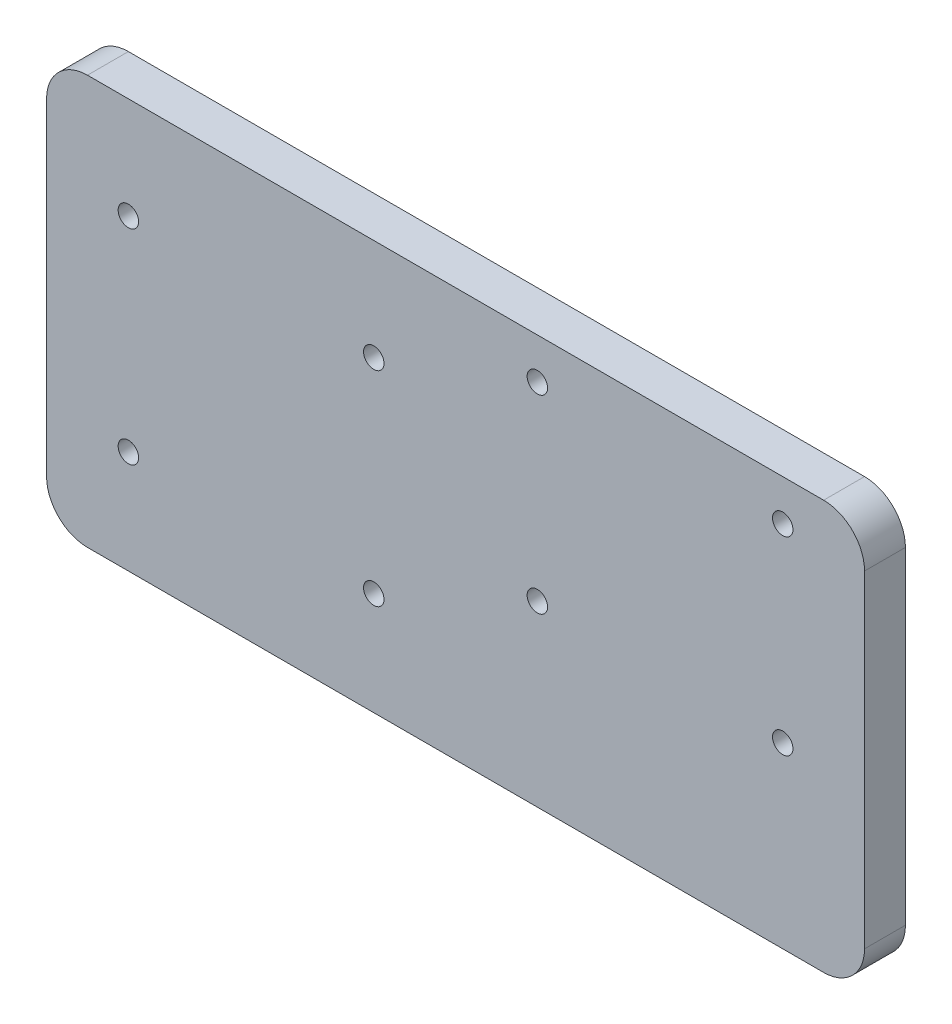
ISO-10303-21;
HEADER;
FILE_DESCRIPTION(('STEP AP214'),'2;1');
FILE_NAME('part.step','',(''),(''),'','','');
FILE_SCHEMA(('AUTOMOTIVE_DESIGN { 1 0 10303 214 1 1 1 1 }'));
ENDSEC;
DATA;
#1=APPLICATION_CONTEXT('core data for automotive mechanical design processes');
#2=APPLICATION_PROTOCOL_DEFINITION('international standard','automotive_design',2000,#1);
#3=PRODUCT_CONTEXT('',#1,'mechanical');
#4=PRODUCT('Part','Part','',(#3));
#5=PRODUCT_RELATED_PRODUCT_CATEGORY('part','',(#4));
#6=PRODUCT_DEFINITION_FORMATION('','',#4);
#7=PRODUCT_DEFINITION_CONTEXT('part definition',#1,'design');
#8=PRODUCT_DEFINITION('design','',#6,#7);
#9=PRODUCT_DEFINITION_SHAPE('','',#8);
#10=(LENGTH_UNIT() NAMED_UNIT(*) SI_UNIT(.MILLI.,.METRE.));
#11=(NAMED_UNIT(*) PLANE_ANGLE_UNIT() SI_UNIT($,.RADIAN.));
#12=(NAMED_UNIT(*) SI_UNIT($,.STERADIAN.) SOLID_ANGLE_UNIT());
#13=UNCERTAINTY_MEASURE_WITH_UNIT(LENGTH_MEASURE(1.E-05),#10,'distance_accuracy_value','');
#14=(GEOMETRIC_REPRESENTATION_CONTEXT(3) GLOBAL_UNCERTAINTY_ASSIGNED_CONTEXT((#13)) GLOBAL_UNIT_ASSIGNED_CONTEXT((#10,
#11,#12)) REPRESENTATION_CONTEXT('',''));
#15=CARTESIAN_POINT('',(0.,0.,0.));
#16=DIRECTION('',(0.,0.,1.));
#17=DIRECTION('',(1.,0.,0.));
#18=AXIS2_PLACEMENT_3D('',#15,#16,#17);
#19=CARTESIAN_POINT('',(-26.3015892013934,-13.0971314207675,11.3107394403225));
#20=DIRECTION('',(1.,0.,0.));
#21=DIRECTION('',(0.,0.,-1.));
#22=AXIS2_PLACEMENT_3D('',#19,#20,#21);
#23=PLANE('',#22);
#24=DIRECTION('',(0.,-1.,0.));
#25=VECTOR('',#24,1.);
#26=CARTESIAN_POINT('',(-26.3015892013934,-13.0971314207675,-1.31176055967752));
#27=LINE('',#26,#25);
#28=CARTESIAN_POINT('',(-26.3015892013934,100.505368579232,-1.31176055967752));
#29=VERTEX_POINT('',#28);
#30=CARTESIAN_POINT('',(-26.3015892013934,-0.474631420767529,-1.31176055967752));
#31=VERTEX_POINT('',#30);
#32=EDGE_CURVE('E241',#29,#31,#27,.T.);
#33=ORIENTED_EDGE('',*,*,#32,.T.);
#34=DIRECTION('',(0.,0.,-1.));
#35=VECTOR('',#34,1.);
#36=CARTESIAN_POINT('',(-26.3015892013934,-0.474631420767529,11.3107394403225));
#37=LINE('',#36,#35);
#38=CARTESIAN_POINT('',(-26.3015892013934,-0.474631420767529,11.3107394403225));
#39=VERTEX_POINT('',#38);
#40=EDGE_CURVE('E277',#31,#39,#37,.F.);
#41=ORIENTED_EDGE('',*,*,#40,.T.);
#42=DIRECTION('',(0.,-1.,0.));
#43=VECTOR('',#42,1.);
#44=CARTESIAN_POINT('',(-26.3015892013934,-13.0971314207675,11.3107394403225));
#45=LINE('',#44,#43);
#46=CARTESIAN_POINT('',(-26.3015892013934,100.505368579232,11.3107394403225));
#47=VERTEX_POINT('',#46);
#48=EDGE_CURVE('E242',#47,#39,#45,.T.);
#49=ORIENTED_EDGE('',*,*,#48,.F.);
#50=DIRECTION('',(0.,0.,-1.));
#51=VECTOR('',#50,1.);
#52=CARTESIAN_POINT('',(-26.3015892013934,100.505368579232,11.3107394403225));
#53=LINE('',#52,#51);
#54=EDGE_CURVE('E253',#47,#29,#53,.T.);
#55=ORIENTED_EDGE('',*,*,#54,.T.);
#56=EDGE_LOOP('',(#33,#41,#49,#55));
#57=FACE_BOUND('',#56,.T.);
#58=ADVANCED_FACE('F37',(#57),#23,.F.);
#59=CARTESIAN_POINT('',(-26.3015892013934,-13.0971314207675,11.3107394403225));
#60=DIRECTION('',(0.,1.,0.));
#61=DIRECTION('',(0.,0.,1.));
#62=AXIS2_PLACEMENT_3D('',#59,#60,#61);
#63=PLANE('',#62);
#64=DIRECTION('',(1.,0.,0.));
#65=VECTOR('',#64,1.);
#66=CARTESIAN_POINT('',(-26.3015892013934,-13.0971314207675,-1.31176055967752));
#67=LINE('',#66,#65);
#68=CARTESIAN_POINT('',(-13.6790892013933,-13.0971314207675,-1.31176055967752));
#69=VERTEX_POINT('',#68);
#70=CARTESIAN_POINT('',(213.525910798607,-13.0971314207675,-1.31176055967752));
#71=VERTEX_POINT('',#70);
#72=EDGE_CURVE('E256',#69,#71,#67,.T.);
#73=ORIENTED_EDGE('',*,*,#72,.T.);
#74=DIRECTION('',(0.,0.,-1.));
#75=VECTOR('',#74,1.);
#76=CARTESIAN_POINT('',(213.525910798607,-13.0971314207675,11.3107394403225));
#77=LINE('',#76,#75);
#78=CARTESIAN_POINT('',(213.525910798607,-13.0971314207675,11.3107394403225));
#79=VERTEX_POINT('',#78);
#80=EDGE_CURVE('E286',#71,#79,#77,.F.);
#81=ORIENTED_EDGE('',*,*,#80,.T.);
#82=DIRECTION('',(1.,0.,0.));
#83=VECTOR('',#82,1.);
#84=CARTESIAN_POINT('',(-26.3015892013934,-13.0971314207675,11.3107394403225));
#85=LINE('',#84,#83);
#86=CARTESIAN_POINT('',(-13.6790892013933,-13.0971314207675,11.3107394403225));
#87=VERTEX_POINT('',#86);
#88=EDGE_CURVE('E245',#87,#79,#85,.T.);
#89=ORIENTED_EDGE('',*,*,#88,.F.);
#90=DIRECTION('',(0.,0.,-1.));
#91=VECTOR('',#90,1.);
#92=CARTESIAN_POINT('',(-13.6790892013933,-13.0971314207675,11.3107394403225));
#93=LINE('',#92,#91);
#94=EDGE_CURVE('E272',#87,#69,#93,.T.);
#95=ORIENTED_EDGE('',*,*,#94,.T.);
#96=EDGE_LOOP('',(#73,#81,#89,#95));
#97=FACE_BOUND('',#96,.T.);
#98=ADVANCED_FACE('F318',(#97),#63,.F.);
#99=CARTESIAN_POINT('',(226.148410798607,-13.0971314207675,11.3107394403225));
#100=DIRECTION('',(-1.,0.,0.));
#101=DIRECTION('',(0.,0.,1.));
#102=AXIS2_PLACEMENT_3D('',#99,#100,#101);
#103=PLANE('',#102);
#104=DIRECTION('',(0.,1.,0.));
#105=VECTOR('',#104,1.);
#106=CARTESIAN_POINT('',(226.148410798607,-13.0971314207675,-1.31176055967752));
#107=LINE('',#106,#105);
#108=CARTESIAN_POINT('',(226.148410798607,-0.474631420767529,-1.31176055967752));
#109=VERTEX_POINT('',#108);
#110=CARTESIAN_POINT('',(226.148410798607,100.505368579232,-1.31176055967752));
#111=VERTEX_POINT('',#110);
#112=EDGE_CURVE('E259',#109,#111,#107,.T.);
#113=ORIENTED_EDGE('',*,*,#112,.T.);
#114=DIRECTION('',(0.,0.,-1.));
#115=VECTOR('',#114,1.);
#116=CARTESIAN_POINT('',(226.148410798607,100.505368579232,11.3107394403225));
#117=LINE('',#116,#115);
#118=CARTESIAN_POINT('',(226.148410798607,100.505368579232,11.3107394403225));
#119=VERTEX_POINT('',#118);
#120=EDGE_CURVE('E45',#111,#119,#117,.F.);
#121=ORIENTED_EDGE('',*,*,#120,.T.);
#122=DIRECTION('',(0.,1.,0.));
#123=VECTOR('',#122,1.);
#124=CARTESIAN_POINT('',(226.148410798607,-13.0971314207675,11.3107394403225));
#125=LINE('',#124,#123);
#126=CARTESIAN_POINT('',(226.148410798607,-0.474631420767529,11.3107394403225));
#127=VERTEX_POINT('',#126);
#128=EDGE_CURVE('E249',#127,#119,#125,.T.);
#129=ORIENTED_EDGE('',*,*,#128,.F.);
#130=DIRECTION('',(0.,0.,-1.));
#131=VECTOR('',#130,1.);
#132=CARTESIAN_POINT('',(226.148410798607,-0.474631420767529,11.3107394403225));
#133=LINE('',#132,#131);
#134=EDGE_CURVE('E281',#127,#109,#133,.T.);
#135=ORIENTED_EDGE('',*,*,#134,.T.);
#136=EDGE_LOOP('',(#113,#121,#129,#135));
#137=FACE_BOUND('',#136,.T.);
#138=ADVANCED_FACE('F324',(#137),#103,.F.);
#139=CARTESIAN_POINT('',(-26.3015892013934,113.127868579232,11.3107394403225));
#140=DIRECTION('',(0.,-1.,0.));
#141=DIRECTION('',(0.,0.,-1.));
#142=AXIS2_PLACEMENT_3D('',#139,#140,#141);
#143=PLANE('',#142);
#144=DIRECTION('',(-1.,0.,0.));
#145=VECTOR('',#144,1.);
#146=CARTESIAN_POINT('',(-26.3015892013934,113.127868579232,11.3107394403225));
#147=LINE('',#146,#145);
#148=CARTESIAN_POINT('',(213.525910798607,113.127868579232,11.3107394403225));
#149=VERTEX_POINT('',#148);
#150=CARTESIAN_POINT('',(-13.6790892013933,113.127868579232,11.3107394403225));
#151=VERTEX_POINT('',#150);
#152=EDGE_CURVE('E251',#149,#151,#147,.T.);
#153=ORIENTED_EDGE('',*,*,#152,.F.);
#154=DIRECTION('',(0.,0.,-1.));
#155=VECTOR('',#154,1.);
#156=CARTESIAN_POINT('',(213.525910798607,113.127868579232,11.3107394403225));
#157=LINE('',#156,#155);
#158=CARTESIAN_POINT('',(213.525910798607,113.127868579232,-1.31176055967752));
#159=VERTEX_POINT('',#158);
#160=EDGE_CURVE('E290',#149,#159,#157,.T.);
#161=ORIENTED_EDGE('',*,*,#160,.T.);
#162=DIRECTION('',(-1.,0.,0.));
#163=VECTOR('',#162,1.);
#164=CARTESIAN_POINT('',(-26.3015892013934,113.127868579232,-1.31176055967752));
#165=LINE('',#164,#163);
#166=CARTESIAN_POINT('',(-13.6790892013933,113.127868579232,-1.31176055967752));
#167=VERTEX_POINT('',#166);
#168=EDGE_CURVE('E246',#159,#167,#165,.T.);
#169=ORIENTED_EDGE('',*,*,#168,.T.);
#170=DIRECTION('',(0.,0.,-1.));
#171=VECTOR('',#170,1.);
#172=CARTESIAN_POINT('',(-13.6790892013933,113.127868579232,11.3107394403225));
#173=LINE('',#172,#171);
#174=EDGE_CURVE('E267',#167,#151,#173,.F.);
#175=ORIENTED_EDGE('',*,*,#174,.T.);
#176=EDGE_LOOP('',(#153,#161,#169,#175));
#177=FACE_BOUND('',#176,.T.);
#178=ADVANCED_FACE('F296',(#177),#143,.F.);
#179=CARTESIAN_POINT('',(-26.3015892013934,-13.0971314207675,11.3107394403225));
#180=DIRECTION('',(0.,0.,-1.));
#181=DIRECTION('',(-1.,0.,0.));
#182=AXIS2_PLACEMENT_3D('',#179,#180,#181);
#183=PLANE('',#182);
#184=CARTESIAN_POINT('',(200.903410798607,41.9723449445708,11.3107394403225));
#185=DIRECTION('',(0.,0.,1.));
#186=DIRECTION('',(1.,0.,0.));
#187=AXIS2_PLACEMENT_3D('',#184,#185,#186);
#188=CIRCLE('',#187,3.155625);
#189=CARTESIAN_POINT('',(204.059035798607,41.9723449445708,11.3107394403225));
#190=VERTEX_POINT('',#189);
#191=EDGE_CURVE('E147',#190,#190,#188,.T.);
#192=ORIENTED_EDGE('',*,*,#191,.F.);
#193=EDGE_LOOP('',(#192));
#194=FACE_BOUND('',#193,.T.);
#195=CARTESIAN_POINT('',(125.168410798607,41.9723449445708,11.3107394403225));
#196=DIRECTION('',(0.,0.,1.));
#197=DIRECTION('',(1.,0.,0.));
#198=AXIS2_PLACEMENT_3D('',#195,#196,#197);
#199=CIRCLE('',#198,3.15562499999999);
#200=CARTESIAN_POINT('',(128.324035798607,41.9723449445708,11.3107394403225));
#201=VERTEX_POINT('',#200);
#202=EDGE_CURVE('E146',#201,#201,#199,.T.);
#203=ORIENTED_EDGE('',*,*,#202,.F.);
#204=EDGE_LOOP('',(#203));
#205=FACE_BOUND('',#204,.T.);
#206=CARTESIAN_POINT('',(200.903410798607,100.505368579233,11.3107394403225));
#207=DIRECTION('',(0.,0.,1.));
#208=DIRECTION('',(1.,0.,0.));
#209=AXIS2_PLACEMENT_3D('',#206,#207,#208);
#210=CIRCLE('',#209,3.155625);
#211=CARTESIAN_POINT('',(204.059035798607,100.505368579233,11.3107394403225));
#212=VERTEX_POINT('',#211);
#213=EDGE_CURVE('E157',#212,#212,#210,.T.);
#214=ORIENTED_EDGE('',*,*,#213,.F.);
#215=EDGE_LOOP('',(#214));
#216=FACE_BOUND('',#215,.T.);
#217=CARTESIAN_POINT('',(125.168410798607,100.505368579233,11.3107394403225));
#218=DIRECTION('',(0.,0.,1.));
#219=DIRECTION('',(1.,0.,0.));
#220=AXIS2_PLACEMENT_3D('',#217,#218,#219);
#221=CIRCLE('',#220,3.155625);
#222=CARTESIAN_POINT('',(128.324035798607,100.505368579233,11.3107394403225));
#223=VERTEX_POINT('',#222);
#224=EDGE_CURVE('E163',#223,#223,#221,.T.);
#225=ORIENTED_EDGE('',*,*,#224,.F.);
#226=EDGE_LOOP('',(#225));
#227=FACE_BOUND('',#226,.T.);
#228=CARTESIAN_POINT('',(74.6784107986066,18.7381008532362,11.3107394403225));
#229=DIRECTION('',(0.,0.,1.));
#230=DIRECTION('',(1.,0.,0.));
#231=AXIS2_PLACEMENT_3D('',#228,#229,#230);
#232=CIRCLE('',#231,3.15562499999999);
#233=CARTESIAN_POINT('',(77.8340357986066,18.7381008532362,11.3107394403225));
#234=VERTEX_POINT('',#233);
#235=EDGE_CURVE('E169',#234,#234,#232,.T.);
#236=ORIENTED_EDGE('',*,*,#235,.F.);
#237=EDGE_LOOP('',(#236));
#238=FACE_BOUND('',#237,.T.);
#239=CARTESIAN_POINT('',(-1.05658920139335,18.7381008532362,11.3107394403225));
#240=DIRECTION('',(0.,0.,1.));
#241=DIRECTION('',(1.,0.,0.));
#242=AXIS2_PLACEMENT_3D('',#239,#240,#241);
#243=CIRCLE('',#242,3.15562499999999);
#244=CARTESIAN_POINT('',(2.09903579860664,18.7381008532362,11.3107394403225));
#245=VERTEX_POINT('',#244);
#246=EDGE_CURVE('E175',#245,#245,#243,.T.);
#247=ORIENTED_EDGE('',*,*,#246,.F.);
#248=EDGE_LOOP('',(#247));
#249=FACE_BOUND('',#248,.T.);
#250=CARTESIAN_POINT('',(74.6784107986066,81.8190446032362,11.3107394403225));
#251=DIRECTION('',(0.,0.,1.));
#252=DIRECTION('',(1.,0.,0.));
#253=AXIS2_PLACEMENT_3D('',#250,#251,#252);
#254=CIRCLE('',#253,3.15562499999999);
#255=CARTESIAN_POINT('',(77.8340357986066,81.8190446032362,11.3107394403225));
#256=VERTEX_POINT('',#255);
#257=EDGE_CURVE('E181',#256,#256,#254,.T.);
#258=ORIENTED_EDGE('',*,*,#257,.F.);
#259=EDGE_LOOP('',(#258));
#260=FACE_BOUND('',#259,.T.);
#261=CARTESIAN_POINT('',(-1.05658920139335,81.8190446032362,11.3107394403225));
#262=DIRECTION('',(0.,0.,1.));
#263=DIRECTION('',(1.,0.,0.));
#264=AXIS2_PLACEMENT_3D('',#261,#262,#263);
#265=CIRCLE('',#264,3.15562499999999);
#266=CARTESIAN_POINT('',(2.09903579860664,81.8190446032362,11.3107394403225));
#267=VERTEX_POINT('',#266);
#268=EDGE_CURVE('E187',#267,#267,#265,.T.);
#269=ORIENTED_EDGE('',*,*,#268,.F.);
#270=EDGE_LOOP('',(#269));
#271=FACE_BOUND('',#270,.T.);
#272=ORIENTED_EDGE('',*,*,#128,.T.);
#273=CARTESIAN_POINT('',(213.525910798607,100.505368579232,11.3107394403225));
#274=DIRECTION('',(0.,0.,-1.));
#275=DIRECTION('',(-1.,0.,0.));
#276=AXIS2_PLACEMENT_3D('',#273,#274,#275);
#277=CIRCLE('',#276,12.6225);
#278=EDGE_CURVE('E11',#119,#149,#277,.F.);
#279=ORIENTED_EDGE('',*,*,#278,.T.);
#280=ORIENTED_EDGE('',*,*,#152,.T.);
#281=CARTESIAN_POINT('',(-13.6790892013933,100.505368579232,11.3107394403225));
#282=DIRECTION('',(0.,0.,-1.));
#283=DIRECTION('',(-1.,0.,0.));
#284=AXIS2_PLACEMENT_3D('',#281,#282,#283);
#285=CIRCLE('',#284,12.6225);
#286=EDGE_CURVE('E270',#151,#47,#285,.F.);
#287=ORIENTED_EDGE('',*,*,#286,.T.);
#288=ORIENTED_EDGE('',*,*,#48,.T.);
#289=CARTESIAN_POINT('',(-13.6790892013933,-0.474631420767529,11.3107394403225));
#290=DIRECTION('',(0.,0.,-1.));
#291=DIRECTION('',(-1.,0.,0.));
#292=AXIS2_PLACEMENT_3D('',#289,#290,#291);
#293=CIRCLE('',#292,12.6225);
#294=EDGE_CURVE('E279',#39,#87,#293,.F.);
#295=ORIENTED_EDGE('',*,*,#294,.T.);
#296=ORIENTED_EDGE('',*,*,#88,.T.);
#297=CARTESIAN_POINT('',(213.525910798607,-0.474631420767529,11.3107394403225));
#298=DIRECTION('',(0.,0.,-1.));
#299=DIRECTION('',(-1.,0.,0.));
#300=AXIS2_PLACEMENT_3D('',#297,#298,#299);
#301=CIRCLE('',#300,12.6225);
#302=EDGE_CURVE('E288',#79,#127,#301,.F.);
#303=ORIENTED_EDGE('',*,*,#302,.T.);
#304=EDGE_LOOP('',(#272,#279,#280,#287,#288,#295,#296,#303));
#305=FACE_BOUND('',#304,.T.);
#306=ADVANCED_FACE('F308',(#194,#205,#216,#227,#238,#249,#260,#271,#305),#183,.F.);
#307=CARTESIAN_POINT('',(-26.3015892013934,-13.0971314207675,-1.31176055967752));
#308=DIRECTION('',(0.,0.,-1.));
#309=DIRECTION('',(-1.,0.,0.));
#310=AXIS2_PLACEMENT_3D('',#307,#308,#309);
#311=PLANE('',#310);
#312=CARTESIAN_POINT('',(74.6784107986066,8.12635676190163,-1.31176055967752));
#313=DIRECTION('',(0.,0.,-1.));
#314=DIRECTION('',(-1.,0.,0.));
#315=AXIS2_PLACEMENT_3D('',#312,#313,#314);
#316=CIRCLE('',#315,5.04899999999999);
#317=CARTESIAN_POINT('',(69.6294107986067,8.12635676190163,-1.31176055967752));
#318=VERTEX_POINT('',#317);
#319=EDGE_CURVE('E193',#318,#318,#316,.T.);
#320=ORIENTED_EDGE('',*,*,#319,.F.);
#321=EDGE_LOOP('',(#320));
#322=FACE_BOUND('',#321,.T.);
#323=CARTESIAN_POINT('',(-1.05658920139335,8.12635676190163,-1.31176055967752));
#324=DIRECTION('',(0.,0.,-1.));
#325=DIRECTION('',(-1.,0.,0.));
#326=AXIS2_PLACEMENT_3D('',#323,#324,#325);
#327=CIRCLE('',#326,5.04899999999999);
#328=CARTESIAN_POINT('',(-6.10558920139334,8.12635676190163,-1.31176055967752));
#329=VERTEX_POINT('',#328);
#330=EDGE_CURVE('E205',#329,#329,#327,.T.);
#331=ORIENTED_EDGE('',*,*,#330,.F.);
#332=EDGE_LOOP('',(#331));
#333=FACE_BOUND('',#332,.T.);
#334=CARTESIAN_POINT('',(-1.05658920139335,92.2553192619017,-1.31176055967752));
#335=DIRECTION('',(0.,0.,-1.));
#336=DIRECTION('',(-1.,0.,0.));
#337=AXIS2_PLACEMENT_3D('',#334,#335,#336);
#338=CIRCLE('',#337,5.04899999999999);
#339=CARTESIAN_POINT('',(-6.10558920139334,92.2553192619017,-1.31176055967752));
#340=VERTEX_POINT('',#339);
#341=EDGE_CURVE('E217',#340,#340,#338,.T.);
#342=ORIENTED_EDGE('',*,*,#341,.F.);
#343=EDGE_LOOP('',(#342));
#344=FACE_BOUND('',#343,.T.);
#345=CARTESIAN_POINT('',(74.6784107986066,92.2553192619017,-1.31176055967752));
#346=DIRECTION('',(0.,0.,-1.));
#347=DIRECTION('',(-1.,0.,0.));
#348=AXIS2_PLACEMENT_3D('',#345,#346,#347);
#349=CIRCLE('',#348,5.04899999999999);
#350=CARTESIAN_POINT('',(69.6294107986067,92.2553192619017,-1.31176055967752));
#351=VERTEX_POINT('',#350);
#352=EDGE_CURVE('E229',#351,#351,#349,.T.);
#353=ORIENTED_EDGE('',*,*,#352,.F.);
#354=EDGE_LOOP('',(#353));
#355=FACE_BOUND('',#354,.T.);
#356=ORIENTED_EDGE('',*,*,#168,.F.);
#357=CARTESIAN_POINT('',(213.525910798607,100.505368579232,-1.31176055967752));
#358=DIRECTION('',(0.,0.,-1.));
#359=DIRECTION('',(-1.,0.,0.));
#360=AXIS2_PLACEMENT_3D('',#357,#358,#359);
#361=CIRCLE('',#360,12.6225);
#362=EDGE_CURVE('E59',#159,#111,#361,.T.);
#363=ORIENTED_EDGE('',*,*,#362,.T.);
#364=ORIENTED_EDGE('',*,*,#112,.F.);
#365=CARTESIAN_POINT('',(213.525910798607,-0.474631420767529,-1.31176055967752));
#366=DIRECTION('',(0.,0.,-1.));
#367=DIRECTION('',(-1.,0.,0.));
#368=AXIS2_PLACEMENT_3D('',#365,#366,#367);
#369=CIRCLE('',#368,12.6225);
#370=EDGE_CURVE('E284',#109,#71,#369,.T.);
#371=ORIENTED_EDGE('',*,*,#370,.T.);
#372=ORIENTED_EDGE('',*,*,#72,.F.);
#373=CARTESIAN_POINT('',(-13.6790892013933,-0.474631420767529,-1.31176055967752));
#374=DIRECTION('',(0.,0.,-1.));
#375=DIRECTION('',(-1.,0.,0.));
#376=AXIS2_PLACEMENT_3D('',#373,#374,#375);
#377=CIRCLE('',#376,12.6225);
#378=EDGE_CURVE('E275',#69,#31,#377,.T.);
#379=ORIENTED_EDGE('',*,*,#378,.T.);
#380=ORIENTED_EDGE('',*,*,#32,.F.);
#381=CARTESIAN_POINT('',(-13.6790892013933,100.505368579232,-1.31176055967752));
#382=DIRECTION('',(0.,0.,-1.));
#383=DIRECTION('',(-1.,0.,0.));
#384=AXIS2_PLACEMENT_3D('',#381,#382,#383);
#385=CIRCLE('',#384,12.6225);
#386=EDGE_CURVE('E264',#29,#167,#385,.T.);
#387=ORIENTED_EDGE('',*,*,#386,.T.);
#388=EDGE_LOOP('',(#356,#363,#364,#371,#372,#379,#380,#387));
#389=FACE_BOUND('',#388,.T.);
#390=ADVANCED_FACE('F299',(#322,#333,#344,#355,#389),#311,.T.);
#391=CARTESIAN_POINT('',(74.6784107986066,92.2553192619017,8.78623944032248));
#392=DIRECTION('',(0.,0.,-1.));
#393=DIRECTION('',(-1.,0.,0.));
#394=AXIS2_PLACEMENT_3D('',#391,#392,#393);
#395=CONICAL_SURFACE('',#394,3.78675,1.02974425867665);
#396=CARTESIAN_POINT('',(74.6784107986066,92.2553192619017,11.0615483894251));
#397=VERTEX_POINT('',#396);
#398=VERTEX_LOOP('',#397);
#399=FACE_BOUND('',#398,.T.);
#400=CARTESIAN_POINT('',(74.6784107986066,92.2553192619017,8.78623944032248));
#401=DIRECTION('',(0.,0.,-1.));
#402=DIRECTION('',(-1.,0.,0.));
#403=AXIS2_PLACEMENT_3D('',#400,#401,#402);
#404=CIRCLE('',#403,3.78675);
#405=CARTESIAN_POINT('',(70.8916607986066,92.2553192619017,8.78623944032248));
#406=VERTEX_POINT('',#405);
#407=EDGE_CURVE('E238',#406,#406,#404,.T.);
#408=ORIENTED_EDGE('',*,*,#407,.T.);
#409=EDGE_LOOP('',(#408));
#410=FACE_BOUND('',#409,.T.);
#411=ADVANCED_FACE('F633',(#399,#410),#395,.F.);
#412=CARTESIAN_POINT('',(74.6784107986066,92.2553192619017,-1.31176055967752));
#413=DIRECTION('',(0.,0.,-1.));
#414=DIRECTION('',(-1.,0.,0.));
#415=AXIS2_PLACEMENT_3D('',#412,#413,#414);
#416=CYLINDRICAL_SURFACE('',#415,3.78675);
#417=ORIENTED_EDGE('',*,*,#407,.F.);
#418=EDGE_LOOP('',(#417));
#419=FACE_BOUND('',#418,.T.);
#420=CARTESIAN_POINT('',(74.6784107986066,92.2553192619017,1.21273944032249));
#421=DIRECTION('',(0.,0.,-1.));
#422=DIRECTION('',(-1.,0.,0.));
#423=AXIS2_PLACEMENT_3D('',#420,#421,#422);
#424=CIRCLE('',#423,3.78675);
#425=CARTESIAN_POINT('',(70.8916607986066,92.2553192619017,1.21273944032249));
#426=VERTEX_POINT('',#425);
#427=EDGE_CURVE('E235',#426,#426,#424,.T.);
#428=ORIENTED_EDGE('',*,*,#427,.T.);
#429=EDGE_LOOP('',(#428));
#430=FACE_BOUND('',#429,.T.);
#431=ADVANCED_FACE('F624',(#419,#430),#416,.F.);
#432=CARTESIAN_POINT('',(78.4651607986066,92.2553192619017,1.21273944032249));
#433=DIRECTION('',(0.,0.,1.));
#434=DIRECTION('',(1.,0.,0.));
#435=AXIS2_PLACEMENT_3D('',#432,#433,#434);
#436=PLANE('',#435);
#437=ORIENTED_EDGE('',*,*,#427,.F.);
#438=EDGE_LOOP('',(#437));
#439=FACE_BOUND('',#438,.T.);
#440=CARTESIAN_POINT('',(74.6784107986066,92.2553192619017,1.21273944032249));
#441=DIRECTION('',(0.,0.,-1.));
#442=DIRECTION('',(-1.,0.,0.));
#443=AXIS2_PLACEMENT_3D('',#440,#441,#442);
#444=CIRCLE('',#443,5.04899999999999);
#445=CARTESIAN_POINT('',(69.6294107986067,92.2553192619017,1.21273944032249));
#446=VERTEX_POINT('',#445);
#447=EDGE_CURVE('E232',#446,#446,#444,.T.);
#448=ORIENTED_EDGE('',*,*,#447,.T.);
#449=EDGE_LOOP('',(#448));
#450=FACE_BOUND('',#449,.T.);
#451=ADVANCED_FACE('F615',(#439,#450),#436,.F.);
#452=CARTESIAN_POINT('',(74.6784107986066,92.2553192619017,-1.31176055967752));
#453=DIRECTION('',(0.,0.,-1.));
#454=DIRECTION('',(-1.,0.,0.));
#455=AXIS2_PLACEMENT_3D('',#452,#453,#454);
#456=CYLINDRICAL_SURFACE('',#455,5.04899999999999);
#457=ORIENTED_EDGE('',*,*,#447,.F.);
#458=EDGE_LOOP('',(#457));
#459=FACE_BOUND('',#458,.T.);
#460=ORIENTED_EDGE('',*,*,#352,.T.);
#461=EDGE_LOOP('',(#460));
#462=FACE_BOUND('',#461,.T.);
#463=ADVANCED_FACE('F606',(#459,#462),#456,.F.);
#464=CARTESIAN_POINT('',(-1.05658920139335,92.2553192619017,8.78623944032248));
#465=DIRECTION('',(0.,0.,-1.));
#466=DIRECTION('',(-1.,0.,0.));
#467=AXIS2_PLACEMENT_3D('',#464,#465,#466);
#468=CONICAL_SURFACE('',#467,3.78675,1.02974425867665);
#469=CARTESIAN_POINT('',(-1.05658920139335,92.2553192619017,11.0615483894251));
#470=VERTEX_POINT('',#469);
#471=VERTEX_LOOP('',#470);
#472=FACE_BOUND('',#471,.T.);
#473=CARTESIAN_POINT('',(-1.05658920139335,92.2553192619017,8.78623944032248));
#474=DIRECTION('',(0.,0.,-1.));
#475=DIRECTION('',(-1.,0.,0.));
#476=AXIS2_PLACEMENT_3D('',#473,#474,#475);
#477=CIRCLE('',#476,3.78675);
#478=CARTESIAN_POINT('',(-4.84333920139335,92.2553192619017,8.78623944032248));
#479=VERTEX_POINT('',#478);
#480=EDGE_CURVE('E226',#479,#479,#477,.T.);
#481=ORIENTED_EDGE('',*,*,#480,.T.);
#482=EDGE_LOOP('',(#481));
#483=FACE_BOUND('',#482,.T.);
#484=ADVANCED_FACE('F597',(#472,#483),#468,.F.);
#485=CARTESIAN_POINT('',(-1.05658920139335,92.2553192619017,-1.31176055967752));
#486=DIRECTION('',(0.,0.,-1.));
#487=DIRECTION('',(-1.,0.,0.));
#488=AXIS2_PLACEMENT_3D('',#485,#486,#487);
#489=CYLINDRICAL_SURFACE('',#488,3.78675);
#490=ORIENTED_EDGE('',*,*,#480,.F.);
#491=EDGE_LOOP('',(#490));
#492=FACE_BOUND('',#491,.T.);
#493=CARTESIAN_POINT('',(-1.05658920139335,92.2553192619017,1.21273944032249));
#494=DIRECTION('',(0.,0.,-1.));
#495=DIRECTION('',(-1.,0.,0.));
#496=AXIS2_PLACEMENT_3D('',#493,#494,#495);
#497=CIRCLE('',#496,3.78675);
#498=CARTESIAN_POINT('',(-4.84333920139335,92.2553192619017,1.21273944032249));
#499=VERTEX_POINT('',#498);
#500=EDGE_CURVE('E223',#499,#499,#497,.T.);
#501=ORIENTED_EDGE('',*,*,#500,.T.);
#502=EDGE_LOOP('',(#501));
#503=FACE_BOUND('',#502,.T.);
#504=ADVANCED_FACE('F588',(#492,#503),#489,.F.);
#505=CARTESIAN_POINT('',(2.73016079860665,92.2553192619017,1.21273944032249));
#506=DIRECTION('',(0.,0.,1.));
#507=DIRECTION('',(1.,0.,0.));
#508=AXIS2_PLACEMENT_3D('',#505,#506,#507);
#509=PLANE('',#508);
#510=ORIENTED_EDGE('',*,*,#500,.F.);
#511=EDGE_LOOP('',(#510));
#512=FACE_BOUND('',#511,.T.);
#513=CARTESIAN_POINT('',(-1.05658920139335,92.2553192619017,1.21273944032249));
#514=DIRECTION('',(0.,0.,-1.));
#515=DIRECTION('',(-1.,0.,0.));
#516=AXIS2_PLACEMENT_3D('',#513,#514,#515);
#517=CIRCLE('',#516,5.04899999999999);
#518=CARTESIAN_POINT('',(-6.10558920139334,92.2553192619017,1.21273944032249));
#519=VERTEX_POINT('',#518);
#520=EDGE_CURVE('E220',#519,#519,#517,.T.);
#521=ORIENTED_EDGE('',*,*,#520,.T.);
#522=EDGE_LOOP('',(#521));
#523=FACE_BOUND('',#522,.T.);
#524=ADVANCED_FACE('F579',(#512,#523),#509,.F.);
#525=CARTESIAN_POINT('',(-1.05658920139335,92.2553192619017,-1.31176055967752));
#526=DIRECTION('',(0.,0.,-1.));
#527=DIRECTION('',(-1.,0.,0.));
#528=AXIS2_PLACEMENT_3D('',#525,#526,#527);
#529=CYLINDRICAL_SURFACE('',#528,5.04899999999999);
#530=ORIENTED_EDGE('',*,*,#520,.F.);
#531=EDGE_LOOP('',(#530));
#532=FACE_BOUND('',#531,.T.);
#533=ORIENTED_EDGE('',*,*,#341,.T.);
#534=EDGE_LOOP('',(#533));
#535=FACE_BOUND('',#534,.T.);
#536=ADVANCED_FACE('F570',(#532,#535),#529,.F.);
#537=CARTESIAN_POINT('',(-1.05658920139335,8.12635676190163,8.78623944032248));
#538=DIRECTION('',(0.,0.,-1.));
#539=DIRECTION('',(-1.,0.,0.));
#540=AXIS2_PLACEMENT_3D('',#537,#538,#539);
#541=CONICAL_SURFACE('',#540,3.78675,1.02974425867665);
#542=CARTESIAN_POINT('',(-1.05658920139335,8.12635676190163,11.0615483894251));
#543=VERTEX_POINT('',#542);
#544=VERTEX_LOOP('',#543);
#545=FACE_BOUND('',#544,.T.);
#546=CARTESIAN_POINT('',(-1.05658920139335,8.12635676190163,8.78623944032248));
#547=DIRECTION('',(0.,0.,-1.));
#548=DIRECTION('',(-1.,0.,0.));
#549=AXIS2_PLACEMENT_3D('',#546,#547,#548);
#550=CIRCLE('',#549,3.78675);
#551=CARTESIAN_POINT('',(-4.84333920139335,8.12635676190163,8.78623944032248));
#552=VERTEX_POINT('',#551);
#553=EDGE_CURVE('E214',#552,#552,#550,.T.);
#554=ORIENTED_EDGE('',*,*,#553,.T.);
#555=EDGE_LOOP('',(#554));
#556=FACE_BOUND('',#555,.T.);
#557=ADVANCED_FACE('F561',(#545,#556),#541,.F.);
#558=CARTESIAN_POINT('',(-1.05658920139335,8.12635676190163,-1.31176055967752));
#559=DIRECTION('',(0.,0.,-1.));
#560=DIRECTION('',(-1.,0.,0.));
#561=AXIS2_PLACEMENT_3D('',#558,#559,#560);
#562=CYLINDRICAL_SURFACE('',#561,3.78675);
#563=ORIENTED_EDGE('',*,*,#553,.F.);
#564=EDGE_LOOP('',(#563));
#565=FACE_BOUND('',#564,.T.);
#566=CARTESIAN_POINT('',(-1.05658920139335,8.12635676190163,1.21273944032249));
#567=DIRECTION('',(0.,0.,-1.));
#568=DIRECTION('',(-1.,0.,0.));
#569=AXIS2_PLACEMENT_3D('',#566,#567,#568);
#570=CIRCLE('',#569,3.78675);
#571=CARTESIAN_POINT('',(-4.84333920139335,8.12635676190163,1.21273944032249));
#572=VERTEX_POINT('',#571);
#573=EDGE_CURVE('E211',#572,#572,#570,.T.);
#574=ORIENTED_EDGE('',*,*,#573,.T.);
#575=EDGE_LOOP('',(#574));
#576=FACE_BOUND('',#575,.T.);
#577=ADVANCED_FACE('F552',(#565,#576),#562,.F.);
#578=CARTESIAN_POINT('',(2.73016079860665,8.12635676190163,1.21273944032249));
#579=DIRECTION('',(0.,0.,1.));
#580=DIRECTION('',(1.,0.,0.));
#581=AXIS2_PLACEMENT_3D('',#578,#579,#580);
#582=PLANE('',#581);
#583=ORIENTED_EDGE('',*,*,#573,.F.);
#584=EDGE_LOOP('',(#583));
#585=FACE_BOUND('',#584,.T.);
#586=CARTESIAN_POINT('',(-1.05658920139335,8.12635676190163,1.21273944032249));
#587=DIRECTION('',(0.,0.,-1.));
#588=DIRECTION('',(-1.,0.,0.));
#589=AXIS2_PLACEMENT_3D('',#586,#587,#588);
#590=CIRCLE('',#589,5.04899999999999);
#591=CARTESIAN_POINT('',(-6.10558920139334,8.12635676190163,1.21273944032249));
#592=VERTEX_POINT('',#591);
#593=EDGE_CURVE('E208',#592,#592,#590,.T.);
#594=ORIENTED_EDGE('',*,*,#593,.T.);
#595=EDGE_LOOP('',(#594));
#596=FACE_BOUND('',#595,.T.);
#597=ADVANCED_FACE('F543',(#585,#596),#582,.F.);
#598=CARTESIAN_POINT('',(-1.05658920139335,8.12635676190163,-1.31176055967752));
#599=DIRECTION('',(0.,0.,-1.));
#600=DIRECTION('',(-1.,0.,0.));
#601=AXIS2_PLACEMENT_3D('',#598,#599,#600);
#602=CYLINDRICAL_SURFACE('',#601,5.04899999999999);
#603=ORIENTED_EDGE('',*,*,#593,.F.);
#604=EDGE_LOOP('',(#603));
#605=FACE_BOUND('',#604,.T.);
#606=ORIENTED_EDGE('',*,*,#330,.T.);
#607=EDGE_LOOP('',(#606));
#608=FACE_BOUND('',#607,.T.);
#609=ADVANCED_FACE('F534',(#605,#608),#602,.F.);
#610=CARTESIAN_POINT('',(74.6784107986066,8.12635676190163,8.78623944032248));
#611=DIRECTION('',(0.,0.,-1.));
#612=DIRECTION('',(-1.,0.,0.));
#613=AXIS2_PLACEMENT_3D('',#610,#611,#612);
#614=CONICAL_SURFACE('',#613,3.78675,1.02974425867665);
#615=CARTESIAN_POINT('',(74.6784107986066,8.12635676190163,11.0615483894251));
#616=VERTEX_POINT('',#615);
#617=VERTEX_LOOP('',#616);
#618=FACE_BOUND('',#617,.T.);
#619=CARTESIAN_POINT('',(74.6784107986066,8.12635676190163,8.78623944032248));
#620=DIRECTION('',(0.,0.,-1.));
#621=DIRECTION('',(-1.,0.,0.));
#622=AXIS2_PLACEMENT_3D('',#619,#620,#621);
#623=CIRCLE('',#622,3.78675);
#624=CARTESIAN_POINT('',(70.8916607986066,8.12635676190163,8.78623944032248));
#625=VERTEX_POINT('',#624);
#626=EDGE_CURVE('E202',#625,#625,#623,.T.);
#627=ORIENTED_EDGE('',*,*,#626,.T.);
#628=EDGE_LOOP('',(#627));
#629=FACE_BOUND('',#628,.T.);
#630=ADVANCED_FACE('F525',(#618,#629),#614,.F.);
#631=CARTESIAN_POINT('',(74.6784107986066,8.12635676190163,-1.31176055967752));
#632=DIRECTION('',(0.,0.,-1.));
#633=DIRECTION('',(-1.,0.,0.));
#634=AXIS2_PLACEMENT_3D('',#631,#632,#633);
#635=CYLINDRICAL_SURFACE('',#634,3.78675);
#636=ORIENTED_EDGE('',*,*,#626,.F.);
#637=EDGE_LOOP('',(#636));
#638=FACE_BOUND('',#637,.T.);
#639=CARTESIAN_POINT('',(74.6784107986066,8.12635676190163,1.21273944032249));
#640=DIRECTION('',(0.,0.,-1.));
#641=DIRECTION('',(-1.,0.,0.));
#642=AXIS2_PLACEMENT_3D('',#639,#640,#641);
#643=CIRCLE('',#642,3.78675);
#644=CARTESIAN_POINT('',(70.8916607986066,8.12635676190163,1.21273944032249));
#645=VERTEX_POINT('',#644);
#646=EDGE_CURVE('E199',#645,#645,#643,.T.);
#647=ORIENTED_EDGE('',*,*,#646,.T.);
#648=EDGE_LOOP('',(#647));
#649=FACE_BOUND('',#648,.T.);
#650=ADVANCED_FACE('F516',(#638,#649),#635,.F.);
#651=CARTESIAN_POINT('',(78.4651607986066,8.12635676190163,1.21273944032249));
#652=DIRECTION('',(0.,0.,1.));
#653=DIRECTION('',(1.,0.,0.));
#654=AXIS2_PLACEMENT_3D('',#651,#652,#653);
#655=PLANE('',#654);
#656=ORIENTED_EDGE('',*,*,#646,.F.);
#657=EDGE_LOOP('',(#656));
#658=FACE_BOUND('',#657,.T.);
#659=CARTESIAN_POINT('',(74.6784107986066,8.12635676190163,1.21273944032249));
#660=DIRECTION('',(0.,0.,-1.));
#661=DIRECTION('',(-1.,0.,0.));
#662=AXIS2_PLACEMENT_3D('',#659,#660,#661);
#663=CIRCLE('',#662,5.04899999999999);
#664=CARTESIAN_POINT('',(69.6294107986067,8.12635676190163,1.21273944032249));
#665=VERTEX_POINT('',#664);
#666=EDGE_CURVE('E196',#665,#665,#663,.T.);
#667=ORIENTED_EDGE('',*,*,#666,.T.);
#668=EDGE_LOOP('',(#667));
#669=FACE_BOUND('',#668,.T.);
#670=ADVANCED_FACE('F507',(#658,#669),#655,.F.);
#671=CARTESIAN_POINT('',(74.6784107986066,8.12635676190163,-1.31176055967752));
#672=DIRECTION('',(0.,0.,-1.));
#673=DIRECTION('',(-1.,0.,0.));
#674=AXIS2_PLACEMENT_3D('',#671,#672,#673);
#675=CYLINDRICAL_SURFACE('',#674,5.04899999999999);
#676=ORIENTED_EDGE('',*,*,#666,.F.);
#677=EDGE_LOOP('',(#676));
#678=FACE_BOUND('',#677,.T.);
#679=ORIENTED_EDGE('',*,*,#319,.T.);
#680=EDGE_LOOP('',(#679));
#681=FACE_BOUND('',#680,.T.);
#682=ADVANCED_FACE('F498',(#678,#681),#675,.F.);
#683=CARTESIAN_POINT('',(-1.05658920139335,81.8190446032362,1.21273944032249));
#684=DIRECTION('',(0.,0.,1.));
#685=DIRECTION('',(1.,0.,0.));
#686=AXIS2_PLACEMENT_3D('',#683,#684,#685);
#687=CONICAL_SURFACE('',#686,3.15562499999999,1.02974425867665);
#688=CARTESIAN_POINT('',(-1.05658920139335,81.8190446032362,-0.683351350596361));
#689=VERTEX_POINT('',#688);
#690=VERTEX_LOOP('',#689);
#691=FACE_BOUND('',#690,.T.);
#692=CARTESIAN_POINT('',(-1.05658920139335,81.8190446032362,1.21273944032249));
#693=DIRECTION('',(0.,0.,1.));
#694=DIRECTION('',(1.,0.,0.));
#695=AXIS2_PLACEMENT_3D('',#692,#693,#694);
#696=CIRCLE('',#695,3.15562499999999);
#697=CARTESIAN_POINT('',(2.09903579860664,81.8190446032362,1.21273944032249));
#698=VERTEX_POINT('',#697);
#699=EDGE_CURVE('E190',#698,#698,#696,.T.);
#700=ORIENTED_EDGE('',*,*,#699,.T.);
#701=EDGE_LOOP('',(#700));
#702=FACE_BOUND('',#701,.T.);
#703=ADVANCED_FACE('F489',(#691,#702),#687,.F.);
#704=CARTESIAN_POINT('',(-1.05658920139335,81.8190446032362,11.3107394403225));
#705=DIRECTION('',(0.,0.,1.));
#706=DIRECTION('',(1.,0.,0.));
#707=AXIS2_PLACEMENT_3D('',#704,#705,#706);
#708=CYLINDRICAL_SURFACE('',#707,3.15562499999999);
#709=ORIENTED_EDGE('',*,*,#699,.F.);
#710=EDGE_LOOP('',(#709));
#711=FACE_BOUND('',#710,.T.);
#712=ORIENTED_EDGE('',*,*,#268,.T.);
#713=EDGE_LOOP('',(#712));
#714=FACE_BOUND('',#713,.T.);
#715=ADVANCED_FACE('F480',(#711,#714),#708,.F.);
#716=CARTESIAN_POINT('',(74.6784107986066,81.8190446032362,1.21273944032249));
#717=DIRECTION('',(0.,0.,1.));
#718=DIRECTION('',(1.,0.,0.));
#719=AXIS2_PLACEMENT_3D('',#716,#717,#718);
#720=CONICAL_SURFACE('',#719,3.15562499999999,1.02974425867665);
#721=CARTESIAN_POINT('',(74.6784107986066,81.8190446032362,-0.683351350596361));
#722=VERTEX_POINT('',#721);
#723=VERTEX_LOOP('',#722);
#724=FACE_BOUND('',#723,.T.);
#725=CARTESIAN_POINT('',(74.6784107986066,81.8190446032362,1.21273944032249));
#726=DIRECTION('',(0.,0.,1.));
#727=DIRECTION('',(1.,0.,0.));
#728=AXIS2_PLACEMENT_3D('',#725,#726,#727);
#729=CIRCLE('',#728,3.15562499999999);
#730=CARTESIAN_POINT('',(77.8340357986066,81.8190446032362,1.21273944032249));
#731=VERTEX_POINT('',#730);
#732=EDGE_CURVE('E184',#731,#731,#729,.T.);
#733=ORIENTED_EDGE('',*,*,#732,.T.);
#734=EDGE_LOOP('',(#733));
#735=FACE_BOUND('',#734,.T.);
#736=ADVANCED_FACE('F471',(#724,#735),#720,.F.);
#737=CARTESIAN_POINT('',(74.6784107986066,81.8190446032362,11.3107394403225));
#738=DIRECTION('',(0.,0.,1.));
#739=DIRECTION('',(1.,0.,0.));
#740=AXIS2_PLACEMENT_3D('',#737,#738,#739);
#741=CYLINDRICAL_SURFACE('',#740,3.15562499999999);
#742=ORIENTED_EDGE('',*,*,#732,.F.);
#743=EDGE_LOOP('',(#742));
#744=FACE_BOUND('',#743,.T.);
#745=ORIENTED_EDGE('',*,*,#257,.T.);
#746=EDGE_LOOP('',(#745));
#747=FACE_BOUND('',#746,.T.);
#748=ADVANCED_FACE('F462',(#744,#747),#741,.F.);
#749=CARTESIAN_POINT('',(-1.05658920139335,18.7381008532362,1.21273944032249));
#750=DIRECTION('',(0.,0.,1.));
#751=DIRECTION('',(1.,0.,0.));
#752=AXIS2_PLACEMENT_3D('',#749,#750,#751);
#753=CONICAL_SURFACE('',#752,3.15562499999999,1.02974425867665);
#754=CARTESIAN_POINT('',(-1.05658920139335,18.7381008532362,-0.683351350596361));
#755=VERTEX_POINT('',#754);
#756=VERTEX_LOOP('',#755);
#757=FACE_BOUND('',#756,.T.);
#758=CARTESIAN_POINT('',(-1.05658920139335,18.7381008532362,1.21273944032249));
#759=DIRECTION('',(0.,0.,1.));
#760=DIRECTION('',(1.,0.,0.));
#761=AXIS2_PLACEMENT_3D('',#758,#759,#760);
#762=CIRCLE('',#761,3.15562499999999);
#763=CARTESIAN_POINT('',(2.09903579860664,18.7381008532362,1.21273944032249));
#764=VERTEX_POINT('',#763);
#765=EDGE_CURVE('E178',#764,#764,#762,.T.);
#766=ORIENTED_EDGE('',*,*,#765,.T.);
#767=EDGE_LOOP('',(#766));
#768=FACE_BOUND('',#767,.T.);
#769=ADVANCED_FACE('F453',(#757,#768),#753,.F.);
#770=CARTESIAN_POINT('',(-1.05658920139335,18.7381008532362,11.3107394403225));
#771=DIRECTION('',(0.,0.,1.));
#772=DIRECTION('',(1.,0.,0.));
#773=AXIS2_PLACEMENT_3D('',#770,#771,#772);
#774=CYLINDRICAL_SURFACE('',#773,3.15562499999999);
#775=ORIENTED_EDGE('',*,*,#765,.F.);
#776=EDGE_LOOP('',(#775));
#777=FACE_BOUND('',#776,.T.);
#778=ORIENTED_EDGE('',*,*,#246,.T.);
#779=EDGE_LOOP('',(#778));
#780=FACE_BOUND('',#779,.T.);
#781=ADVANCED_FACE('F444',(#777,#780),#774,.F.);
#782=CARTESIAN_POINT('',(74.6784107986066,18.7381008532362,1.21273944032249));
#783=DIRECTION('',(0.,0.,1.));
#784=DIRECTION('',(1.,0.,0.));
#785=AXIS2_PLACEMENT_3D('',#782,#783,#784);
#786=CONICAL_SURFACE('',#785,3.15562499999999,1.02974425867665);
#787=CARTESIAN_POINT('',(74.6784107986066,18.7381008532362,-0.683351350596361));
#788=VERTEX_POINT('',#787);
#789=VERTEX_LOOP('',#788);
#790=FACE_BOUND('',#789,.T.);
#791=CARTESIAN_POINT('',(74.6784107986066,18.7381008532362,1.21273944032249));
#792=DIRECTION('',(0.,0.,1.));
#793=DIRECTION('',(1.,0.,0.));
#794=AXIS2_PLACEMENT_3D('',#791,#792,#793);
#795=CIRCLE('',#794,3.15562499999999);
#796=CARTESIAN_POINT('',(77.8340357986066,18.7381008532362,1.21273944032249));
#797=VERTEX_POINT('',#796);
#798=EDGE_CURVE('E172',#797,#797,#795,.T.);
#799=ORIENTED_EDGE('',*,*,#798,.T.);
#800=EDGE_LOOP('',(#799));
#801=FACE_BOUND('',#800,.T.);
#802=ADVANCED_FACE('F435',(#790,#801),#786,.F.);
#803=CARTESIAN_POINT('',(74.6784107986066,18.7381008532362,11.3107394403225));
#804=DIRECTION('',(0.,0.,1.));
#805=DIRECTION('',(1.,0.,0.));
#806=AXIS2_PLACEMENT_3D('',#803,#804,#805);
#807=CYLINDRICAL_SURFACE('',#806,3.15562499999999);
#808=ORIENTED_EDGE('',*,*,#798,.F.);
#809=EDGE_LOOP('',(#808));
#810=FACE_BOUND('',#809,.T.);
#811=ORIENTED_EDGE('',*,*,#235,.T.);
#812=EDGE_LOOP('',(#811));
#813=FACE_BOUND('',#812,.T.);
#814=ADVANCED_FACE('F426',(#810,#813),#807,.F.);
#815=CARTESIAN_POINT('',(125.168410798607,100.505368579233,1.21273944032248));
#816=DIRECTION('',(0.,0.,1.));
#817=DIRECTION('',(1.,0.,0.));
#818=AXIS2_PLACEMENT_3D('',#815,#816,#817);
#819=CONICAL_SURFACE('',#818,3.155625,1.02974425867666);
#820=CARTESIAN_POINT('',(125.168410798607,100.505368579233,-0.683351350596361));
#821=VERTEX_POINT('',#820);
#822=VERTEX_LOOP('',#821);
#823=FACE_BOUND('',#822,.T.);
#824=CARTESIAN_POINT('',(125.168410798607,100.505368579233,1.21273944032248));
#825=DIRECTION('',(0.,0.,1.));
#826=DIRECTION('',(1.,0.,0.));
#827=AXIS2_PLACEMENT_3D('',#824,#825,#826);
#828=CIRCLE('',#827,3.155625);
#829=CARTESIAN_POINT('',(128.324035798607,100.505368579233,1.21273944032248));
#830=VERTEX_POINT('',#829);
#831=EDGE_CURVE('E166',#830,#830,#828,.T.);
#832=ORIENTED_EDGE('',*,*,#831,.T.);
#833=EDGE_LOOP('',(#832));
#834=FACE_BOUND('',#833,.T.);
#835=ADVANCED_FACE('F417',(#823,#834),#819,.F.);
#836=CARTESIAN_POINT('',(125.168410798607,100.505368579233,11.3107394403225));
#837=DIRECTION('',(0.,0.,1.));
#838=DIRECTION('',(1.,0.,0.));
#839=AXIS2_PLACEMENT_3D('',#836,#837,#838);
#840=CYLINDRICAL_SURFACE('',#839,3.155625);
#841=ORIENTED_EDGE('',*,*,#831,.F.);
#842=EDGE_LOOP('',(#841));
#843=FACE_BOUND('',#842,.T.);
#844=ORIENTED_EDGE('',*,*,#224,.T.);
#845=EDGE_LOOP('',(#844));
#846=FACE_BOUND('',#845,.T.);
#847=ADVANCED_FACE('F407',(#843,#846),#840,.F.);
#848=CARTESIAN_POINT('',(200.903410798607,100.505368579233,1.21273944032249));
#849=DIRECTION('',(0.,0.,1.));
#850=DIRECTION('',(1.,0.,0.));
#851=AXIS2_PLACEMENT_3D('',#848,#849,#850);
#852=CONICAL_SURFACE('',#851,3.15562499999997,1.02974425867665);
#853=CARTESIAN_POINT('',(200.903410798607,100.505368579233,-0.683351350596361));
#854=VERTEX_POINT('',#853);
#855=VERTEX_LOOP('',#854);
#856=FACE_BOUND('',#855,.T.);
#857=CARTESIAN_POINT('',(200.903410798607,100.505368579233,1.21273944032249));
#858=DIRECTION('',(0.,0.,1.));
#859=DIRECTION('',(1.,0.,0.));
#860=AXIS2_PLACEMENT_3D('',#857,#858,#859);
#861=CIRCLE('',#860,3.15562499999997);
#862=CARTESIAN_POINT('',(204.059035798607,100.505368579233,1.21273944032249));
#863=VERTEX_POINT('',#862);
#864=EDGE_CURVE('E160',#863,#863,#861,.T.);
#865=ORIENTED_EDGE('',*,*,#864,.T.);
#866=EDGE_LOOP('',(#865));
#867=FACE_BOUND('',#866,.T.);
#868=ADVANCED_FACE('F398',(#856,#867),#852,.F.);
#869=CARTESIAN_POINT('',(200.903410798607,100.505368579233,11.3107394403225));
#870=DIRECTION('',(0.,0.,1.));
#871=DIRECTION('',(1.,0.,0.));
#872=AXIS2_PLACEMENT_3D('',#869,#870,#871);
#873=CYLINDRICAL_SURFACE('',#872,3.15562499999999);
#874=ORIENTED_EDGE('',*,*,#864,.F.);
#875=EDGE_LOOP('',(#874));
#876=FACE_BOUND('',#875,.T.);
#877=ORIENTED_EDGE('',*,*,#213,.T.);
#878=EDGE_LOOP('',(#877));
#879=FACE_BOUND('',#878,.T.);
#880=ADVANCED_FACE('F389',(#876,#879),#873,.F.);
#881=CARTESIAN_POINT('',(125.168410798607,41.9723449445708,1.21273944032249));
#882=DIRECTION('',(0.,0.,1.));
#883=DIRECTION('',(1.,0.,0.));
#884=AXIS2_PLACEMENT_3D('',#881,#882,#883);
#885=CONICAL_SURFACE('',#884,3.15562499999999,1.02974425867665);
#886=CARTESIAN_POINT('',(125.168410798607,41.9723449445708,-0.683351350596361));
#887=VERTEX_POINT('',#886);
#888=VERTEX_LOOP('',#887);
#889=FACE_BOUND('',#888,.T.);
#890=CARTESIAN_POINT('',(125.168410798607,41.9723449445708,1.21273944032249));
#891=DIRECTION('',(0.,0.,1.));
#892=DIRECTION('',(1.,0.,0.));
#893=AXIS2_PLACEMENT_3D('',#890,#891,#892);
#894=CIRCLE('',#893,3.15562499999999);
#895=CARTESIAN_POINT('',(128.324035798607,41.9723449445708,1.21273944032249));
#896=VERTEX_POINT('',#895);
#897=EDGE_CURVE('E150',#896,#896,#894,.T.);
#898=ORIENTED_EDGE('',*,*,#897,.T.);
#899=EDGE_LOOP('',(#898));
#900=FACE_BOUND('',#899,.T.);
#901=ADVANCED_FACE('F380',(#889,#900),#885,.F.);
#902=CARTESIAN_POINT('',(125.168410798607,41.9723449445708,11.3107394403225));
#903=DIRECTION('',(0.,0.,1.));
#904=DIRECTION('',(1.,0.,0.));
#905=AXIS2_PLACEMENT_3D('',#902,#903,#904);
#906=CYLINDRICAL_SURFACE('',#905,3.15562499999999);
#907=ORIENTED_EDGE('',*,*,#897,.F.);
#908=EDGE_LOOP('',(#907));
#909=FACE_BOUND('',#908,.T.);
#910=ORIENTED_EDGE('',*,*,#202,.T.);
#911=EDGE_LOOP('',(#910));
#912=FACE_BOUND('',#911,.T.);
#913=ADVANCED_FACE('F140',(#909,#912),#906,.F.);
#914=CARTESIAN_POINT('',(200.903410798607,41.9723449445708,1.21273944032248));
#915=DIRECTION('',(0.,0.,1.));
#916=DIRECTION('',(1.,0.,0.));
#917=AXIS2_PLACEMENT_3D('',#914,#915,#916);
#918=CONICAL_SURFACE('',#917,3.155625,1.02974425867666);
#919=CARTESIAN_POINT('',(200.903410798607,41.9723449445708,-0.683351350596361));
#920=VERTEX_POINT('',#919);
#921=VERTEX_LOOP('',#920);
#922=FACE_BOUND('',#921,.T.);
#923=CARTESIAN_POINT('',(200.903410798607,41.9723449445708,1.21273944032248));
#924=DIRECTION('',(0.,0.,1.));
#925=DIRECTION('',(1.,0.,0.));
#926=AXIS2_PLACEMENT_3D('',#923,#924,#925);
#927=CIRCLE('',#926,3.155625);
#928=CARTESIAN_POINT('',(204.059035798607,41.9723449445708,1.21273944032248));
#929=VERTEX_POINT('',#928);
#930=EDGE_CURVE('E144',#929,#929,#927,.T.);
#931=ORIENTED_EDGE('',*,*,#930,.T.);
#932=EDGE_LOOP('',(#931));
#933=FACE_BOUND('',#932,.T.);
#934=ADVANCED_FACE('F136',(#922,#933),#918,.F.);
#935=CARTESIAN_POINT('',(200.903410798607,41.9723449445708,11.3107394403225));
#936=DIRECTION('',(0.,0.,1.));
#937=DIRECTION('',(1.,0.,0.));
#938=AXIS2_PLACEMENT_3D('',#935,#936,#937);
#939=CYLINDRICAL_SURFACE('',#938,3.155625);
#940=ORIENTED_EDGE('',*,*,#930,.F.);
#941=EDGE_LOOP('',(#940));
#942=FACE_BOUND('',#941,.T.);
#943=ORIENTED_EDGE('',*,*,#191,.T.);
#944=EDGE_LOOP('',(#943));
#945=FACE_BOUND('',#944,.T.);
#946=ADVANCED_FACE('F139',(#942,#945),#939,.F.);
#947=CARTESIAN_POINT('',(-13.6790892013933,100.505368579232,11.3107394403225));
#948=DIRECTION('',(0.,0.,-1.));
#949=DIRECTION('',(-1.,0.,0.));
#950=AXIS2_PLACEMENT_3D('',#947,#948,#949);
#951=CYLINDRICAL_SURFACE('',#950,12.6225);
#952=ORIENTED_EDGE('',*,*,#286,.F.);
#953=ORIENTED_EDGE('',*,*,#174,.F.);
#954=ORIENTED_EDGE('',*,*,#386,.F.);
#955=ORIENTED_EDGE('',*,*,#54,.F.);
#956=EDGE_LOOP('',(#952,#953,#954,#955));
#957=FACE_BOUND('',#956,.T.);
#958=ADVANCED_FACE('F305',(#957),#951,.T.);
#959=CARTESIAN_POINT('',(-13.6790892013933,-0.474631420767529,11.3107394403225));
#960=DIRECTION('',(0.,0.,-1.));
#961=DIRECTION('',(-1.,0.,0.));
#962=AXIS2_PLACEMENT_3D('',#959,#960,#961);
#963=CYLINDRICAL_SURFACE('',#962,12.6225);
#964=ORIENTED_EDGE('',*,*,#294,.F.);
#965=ORIENTED_EDGE('',*,*,#40,.F.);
#966=ORIENTED_EDGE('',*,*,#378,.F.);
#967=ORIENTED_EDGE('',*,*,#94,.F.);
#968=EDGE_LOOP('',(#964,#965,#966,#967));
#969=FACE_BOUND('',#968,.T.);
#970=ADVANCED_FACE('F313',(#969),#963,.T.);
#971=CARTESIAN_POINT('',(213.525910798607,-0.474631420767529,11.3107394403225));
#972=DIRECTION('',(0.,0.,-1.));
#973=DIRECTION('',(-1.,0.,0.));
#974=AXIS2_PLACEMENT_3D('',#971,#972,#973);
#975=CYLINDRICAL_SURFACE('',#974,12.6225);
#976=ORIENTED_EDGE('',*,*,#302,.F.);
#977=ORIENTED_EDGE('',*,*,#80,.F.);
#978=ORIENTED_EDGE('',*,*,#370,.F.);
#979=ORIENTED_EDGE('',*,*,#134,.F.);
#980=EDGE_LOOP('',(#976,#977,#978,#979));
#981=FACE_BOUND('',#980,.T.);
#982=ADVANCED_FACE('F322',(#981),#975,.T.);
#983=CARTESIAN_POINT('',(213.525910798607,100.505368579232,11.3107394403225));
#984=DIRECTION('',(0.,0.,-1.));
#985=DIRECTION('',(-1.,0.,0.));
#986=AXIS2_PLACEMENT_3D('',#983,#984,#985);
#987=CYLINDRICAL_SURFACE('',#986,12.6225);
#988=ORIENTED_EDGE('',*,*,#278,.F.);
#989=ORIENTED_EDGE('',*,*,#120,.F.);
#990=ORIENTED_EDGE('',*,*,#362,.F.);
#991=ORIENTED_EDGE('',*,*,#160,.F.);
#992=EDGE_LOOP('',(#988,#989,#990,#991));
#993=FACE_BOUND('',#992,.T.);
#994=ADVANCED_FACE('F39',(#993),#987,.T.);
#995=CLOSED_SHELL('',(#58,#98,#138,#178,#306,#390,#411,#431,#451,#463,#484,#504,#524,#536,#557,
#577,#597,#609,#630,#650,#670,#682,#703,#715,#736,#748,#769,#781,#802,#814,#835,#847,#868,#880,
#901,#913,#934,#946,#958,#970,#982,#994));
#996=MANIFOLD_SOLID_BREP('B2',#995);
#997=ADVANCED_BREP_SHAPE_REPRESENTATION('',(#18,#996),#14);
#998=SHAPE_DEFINITION_REPRESENTATION(#9,#997);
ENDSEC;
END-ISO-10303-21;
